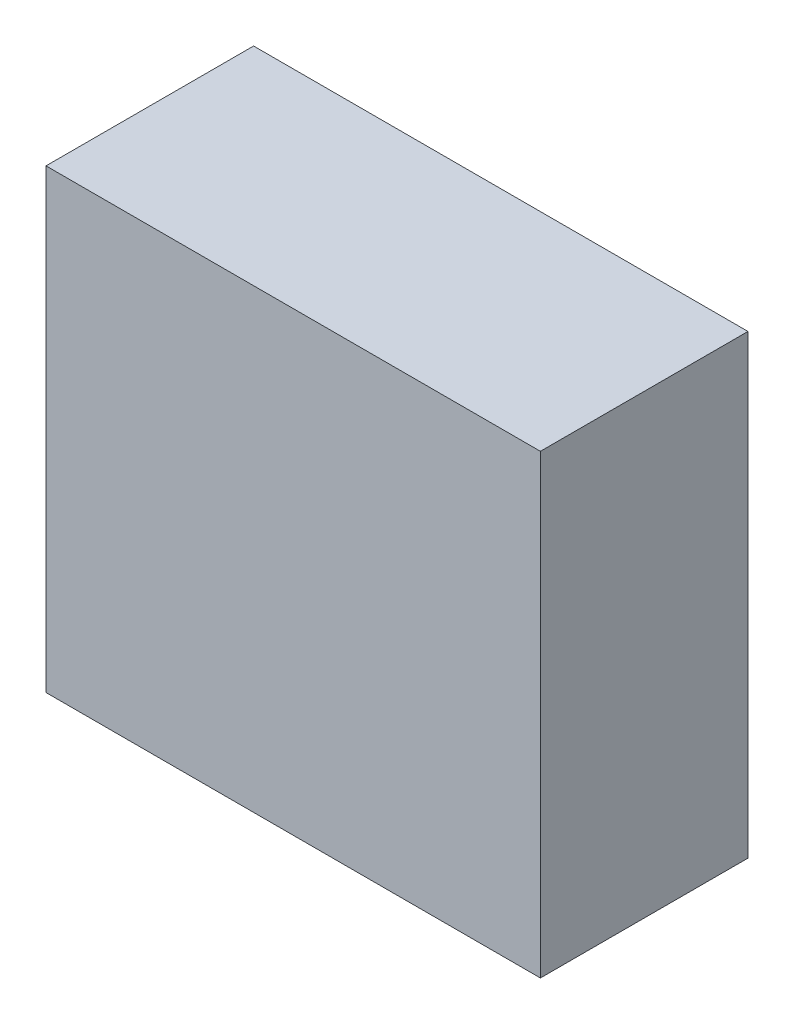
ISO-10303-21;
HEADER;
FILE_DESCRIPTION(('STEP AP214'),'2;1');
FILE_NAME('part.step','',(''),(''),'','','');
FILE_SCHEMA(('AUTOMOTIVE_DESIGN { 1 0 10303 214 1 1 1 1 }'));
ENDSEC;
DATA;
#1=APPLICATION_CONTEXT('core data for automotive mechanical design processes');
#2=APPLICATION_PROTOCOL_DEFINITION('international standard','automotive_design',2000,#1);
#3=PRODUCT_CONTEXT('',#1,'mechanical');
#4=PRODUCT('Part','Part','',(#3));
#5=PRODUCT_RELATED_PRODUCT_CATEGORY('part','',(#4));
#6=PRODUCT_DEFINITION_FORMATION('','',#4);
#7=PRODUCT_DEFINITION_CONTEXT('part definition',#1,'design');
#8=PRODUCT_DEFINITION('design','',#6,#7);
#9=PRODUCT_DEFINITION_SHAPE('','',#8);
#10=(LENGTH_UNIT() NAMED_UNIT(*) SI_UNIT(.MILLI.,.METRE.));
#11=(NAMED_UNIT(*) PLANE_ANGLE_UNIT() SI_UNIT($,.RADIAN.));
#12=(NAMED_UNIT(*) SI_UNIT($,.STERADIAN.) SOLID_ANGLE_UNIT());
#13=UNCERTAINTY_MEASURE_WITH_UNIT(LENGTH_MEASURE(1.E-05),#10,'distance_accuracy_value','');
#14=(GEOMETRIC_REPRESENTATION_CONTEXT(3) GLOBAL_UNCERTAINTY_ASSIGNED_CONTEXT((#13)) GLOBAL_UNIT_ASSIGNED_CONTEXT((#10,
#11,#12)) REPRESENTATION_CONTEXT('',''));
#15=CARTESIAN_POINT('',(0.,0.,0.));
#16=DIRECTION('',(0.,0.,1.));
#17=DIRECTION('',(1.,0.,0.));
#18=AXIS2_PLACEMENT_3D('',#15,#16,#17);
#19=CARTESIAN_POINT('',(90.5,167.,38.));
#20=DIRECTION('',(-1.,0.,0.));
#21=DIRECTION('',(0.,0.,1.));
#22=AXIS2_PLACEMENT_3D('',#19,#20,#21);
#23=PLANE('',#22);
#24=DIRECTION('',(0.,0.,-1.));
#25=VECTOR('',#24,1.);
#26=CARTESIAN_POINT('',(90.5,0.,38.));
#27=LINE('',#26,#25);
#28=CARTESIAN_POINT('',(90.5,0.,38.));
#29=VERTEX_POINT('',#28);
#30=CARTESIAN_POINT('',(90.5,0.,-38.));
#31=VERTEX_POINT('',#30);
#32=EDGE_CURVE('E97',#29,#31,#27,.T.);
#33=ORIENTED_EDGE('',*,*,#32,.T.);
#34=DIRECTION('',(0.,-1.,0.));
#35=VECTOR('',#34,1.);
#36=CARTESIAN_POINT('',(90.5,167.,-38.));
#37=LINE('',#36,#35);
#38=CARTESIAN_POINT('',(90.5,167.,-38.));
#39=VERTEX_POINT('',#38);
#40=EDGE_CURVE('E11',#39,#31,#37,.T.);
#41=ORIENTED_EDGE('',*,*,#40,.F.);
#42=DIRECTION('',(0.,0.,-1.));
#43=VECTOR('',#42,1.);
#44=CARTESIAN_POINT('',(90.5,167.,38.));
#45=LINE('',#44,#43);
#46=CARTESIAN_POINT('',(90.5,167.,38.));
#47=VERTEX_POINT('',#46);
#48=EDGE_CURVE('E85',#47,#39,#45,.T.);
#49=ORIENTED_EDGE('',*,*,#48,.F.);
#50=DIRECTION('',(0.,-1.,0.));
#51=VECTOR('',#50,1.);
#52=CARTESIAN_POINT('',(90.5,167.,38.));
#53=LINE('',#52,#51);
#54=EDGE_CURVE('E93',#47,#29,#53,.T.);
#55=ORIENTED_EDGE('',*,*,#54,.T.);
#56=EDGE_LOOP('',(#33,#41,#49,#55));
#57=FACE_BOUND('',#56,.T.);
#58=ADVANCED_FACE('F34',(#57),#23,.F.);
#59=CARTESIAN_POINT('',(-90.5,167.,-38.));
#60=DIRECTION('',(0.,0.,1.));
#61=DIRECTION('',(1.,0.,0.));
#62=AXIS2_PLACEMENT_3D('',#59,#60,#61);
#63=PLANE('',#62);
#64=DIRECTION('',(-1.,0.,0.));
#65=VECTOR('',#64,1.);
#66=CARTESIAN_POINT('',(-90.5,0.,-38.));
#67=LINE('',#66,#65);
#68=CARTESIAN_POINT('',(-90.5,0.,-38.));
#69=VERTEX_POINT('',#68);
#70=EDGE_CURVE('E89',#31,#69,#67,.T.);
#71=ORIENTED_EDGE('',*,*,#70,.T.);
#72=DIRECTION('',(0.,-1.,0.));
#73=VECTOR('',#72,1.);
#74=CARTESIAN_POINT('',(-90.5,167.,-38.));
#75=LINE('',#74,#73);
#76=CARTESIAN_POINT('',(-90.5,167.,-38.));
#77=VERTEX_POINT('',#76);
#78=EDGE_CURVE('E42',#77,#69,#75,.T.);
#79=ORIENTED_EDGE('',*,*,#78,.F.);
#80=DIRECTION('',(-1.,0.,0.));
#81=VECTOR('',#80,1.);
#82=CARTESIAN_POINT('',(-90.5,167.,-38.));
#83=LINE('',#82,#81);
#84=EDGE_CURVE('E80',#39,#77,#83,.T.);
#85=ORIENTED_EDGE('',*,*,#84,.F.);
#86=ORIENTED_EDGE('',*,*,#40,.T.);
#87=EDGE_LOOP('',(#71,#79,#85,#86));
#88=FACE_BOUND('',#87,.T.);
#89=ADVANCED_FACE('F88',(#88),#63,.F.);
#90=CARTESIAN_POINT('',(-90.5,167.,38.));
#91=DIRECTION('',(1.,0.,0.));
#92=DIRECTION('',(0.,0.,-1.));
#93=AXIS2_PLACEMENT_3D('',#90,#91,#92);
#94=PLANE('',#93);
#95=DIRECTION('',(0.,0.,1.));
#96=VECTOR('',#95,1.);
#97=CARTESIAN_POINT('',(-90.5,0.,38.));
#98=LINE('',#97,#96);
#99=CARTESIAN_POINT('',(-90.5,0.,38.));
#100=VERTEX_POINT('',#99);
#101=EDGE_CURVE('E67',#69,#100,#98,.T.);
#102=ORIENTED_EDGE('',*,*,#101,.T.);
#103=DIRECTION('',(0.,-1.,0.));
#104=VECTOR('',#103,1.);
#105=CARTESIAN_POINT('',(-90.5,167.,38.));
#106=LINE('',#105,#104);
#107=CARTESIAN_POINT('',(-90.5,167.,38.));
#108=VERTEX_POINT('',#107);
#109=EDGE_CURVE('E90',#108,#100,#106,.T.);
#110=ORIENTED_EDGE('',*,*,#109,.F.);
#111=DIRECTION('',(0.,0.,1.));
#112=VECTOR('',#111,1.);
#113=CARTESIAN_POINT('',(-90.5,167.,38.));
#114=LINE('',#113,#112);
#115=EDGE_CURVE('E83',#77,#108,#114,.T.);
#116=ORIENTED_EDGE('',*,*,#115,.F.);
#117=ORIENTED_EDGE('',*,*,#78,.T.);
#118=EDGE_LOOP('',(#102,#110,#116,#117));
#119=FACE_BOUND('',#118,.T.);
#120=ADVANCED_FACE('F91',(#119),#94,.F.);
#121=CARTESIAN_POINT('',(-90.5,167.,38.));
#122=DIRECTION('',(0.,0.,-1.));
#123=DIRECTION('',(-1.,0.,0.));
#124=AXIS2_PLACEMENT_3D('',#121,#122,#123);
#125=PLANE('',#124);
#126=DIRECTION('',(1.,0.,0.));
#127=VECTOR('',#126,1.);
#128=CARTESIAN_POINT('',(-90.5,0.,38.));
#129=LINE('',#128,#127);
#130=EDGE_CURVE('E73',#100,#29,#129,.T.);
#131=ORIENTED_EDGE('',*,*,#130,.T.);
#132=ORIENTED_EDGE('',*,*,#54,.F.);
#133=DIRECTION('',(1.,0.,0.));
#134=VECTOR('',#133,1.);
#135=CARTESIAN_POINT('',(-90.5,167.,38.));
#136=LINE('',#135,#134);
#137=EDGE_CURVE('E50',#108,#47,#136,.T.);
#138=ORIENTED_EDGE('',*,*,#137,.F.);
#139=ORIENTED_EDGE('',*,*,#109,.T.);
#140=EDGE_LOOP('',(#131,#132,#138,#139));
#141=FACE_BOUND('',#140,.T.);
#142=ADVANCED_FACE('F104',(#141),#125,.F.);
#143=CARTESIAN_POINT('',(0.,167.,0.));
#144=DIRECTION('',(0.,-1.,0.));
#145=DIRECTION('',(0.,0.,-1.));
#146=AXIS2_PLACEMENT_3D('',#143,#144,#145);
#147=PLANE('',#146);
#148=ORIENTED_EDGE('',*,*,#48,.T.);
#149=ORIENTED_EDGE('',*,*,#84,.T.);
#150=ORIENTED_EDGE('',*,*,#115,.T.);
#151=ORIENTED_EDGE('',*,*,#137,.T.);
#152=EDGE_LOOP('',(#148,#149,#150,#151));
#153=FACE_BOUND('',#152,.T.);
#154=ADVANCED_FACE('F81',(#153),#147,.F.);
#155=CARTESIAN_POINT('',(0.,0.,0.));
#156=DIRECTION('',(0.,-1.,0.));
#157=DIRECTION('',(0.,0.,-1.));
#158=AXIS2_PLACEMENT_3D('',#155,#156,#157);
#159=PLANE('',#158);
#160=ORIENTED_EDGE('',*,*,#32,.F.);
#161=ORIENTED_EDGE('',*,*,#130,.F.);
#162=ORIENTED_EDGE('',*,*,#101,.F.);
#163=ORIENTED_EDGE('',*,*,#70,.F.);
#164=EDGE_LOOP('',(#160,#161,#162,#163));
#165=FACE_BOUND('',#164,.T.);
#166=ADVANCED_FACE('F107',(#165),#159,.T.);
#167=CLOSED_SHELL('',(#58,#89,#120,#142,#154,#166));
#168=MANIFOLD_SOLID_BREP('B2',#167);
#169=ADVANCED_BREP_SHAPE_REPRESENTATION('',(#18,#168),#14);
#170=SHAPE_DEFINITION_REPRESENTATION(#9,#169);
ENDSEC;
END-ISO-10303-21;
